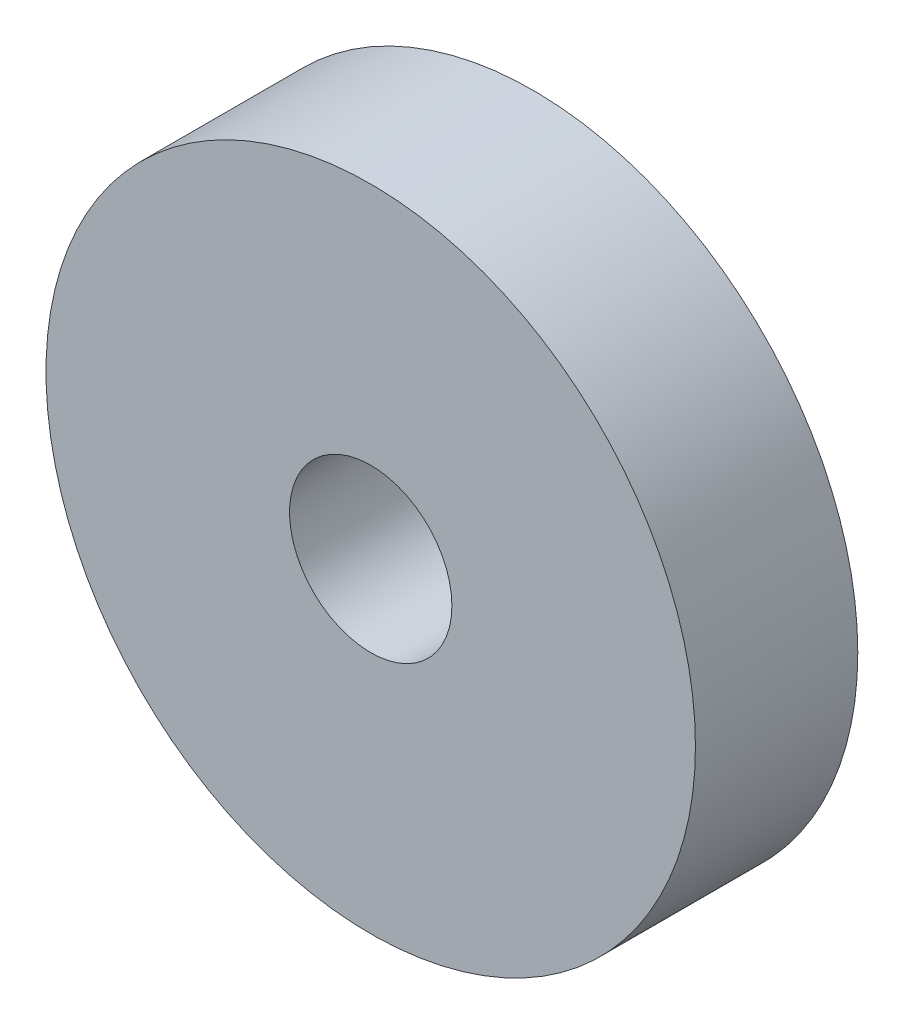
ISO-10303-21;
HEADER;
FILE_DESCRIPTION(('STEP AP214'),'2;1');
FILE_NAME('part.step','',(''),(''),'','','');
FILE_SCHEMA(('AUTOMOTIVE_DESIGN { 1 0 10303 214 1 1 1 1 }'));
ENDSEC;
DATA;
#1=APPLICATION_CONTEXT('core data for automotive mechanical design processes');
#2=APPLICATION_PROTOCOL_DEFINITION('international standard','automotive_design',2000,#1);
#3=PRODUCT_CONTEXT('',#1,'mechanical');
#4=PRODUCT('Part','Part','',(#3));
#5=PRODUCT_RELATED_PRODUCT_CATEGORY('part','',(#4));
#6=PRODUCT_DEFINITION_FORMATION('','',#4);
#7=PRODUCT_DEFINITION_CONTEXT('part definition',#1,'design');
#8=PRODUCT_DEFINITION('design','',#6,#7);
#9=PRODUCT_DEFINITION_SHAPE('','',#8);
#10=(LENGTH_UNIT() NAMED_UNIT(*) SI_UNIT(.MILLI.,.METRE.));
#11=(NAMED_UNIT(*) PLANE_ANGLE_UNIT() SI_UNIT($,.RADIAN.));
#12=(NAMED_UNIT(*) SI_UNIT($,.STERADIAN.) SOLID_ANGLE_UNIT());
#13=UNCERTAINTY_MEASURE_WITH_UNIT(LENGTH_MEASURE(1.E-05),#10,'distance_accuracy_value','');
#14=(GEOMETRIC_REPRESENTATION_CONTEXT(3) GLOBAL_UNCERTAINTY_ASSIGNED_CONTEXT((#13)) GLOBAL_UNIT_ASSIGNED_CONTEXT((#10,
#11,#12)) REPRESENTATION_CONTEXT('',''));
#15=CARTESIAN_POINT('',(0.,0.,0.));
#16=DIRECTION('',(0.,0.,1.));
#17=DIRECTION('',(1.,0.,0.));
#18=AXIS2_PLACEMENT_3D('',#15,#16,#17);
#19=CARTESIAN_POINT('',(0.,0.,12.7));
#20=DIRECTION('',(0.,0.,1.));
#21=DIRECTION('',(1.,0.,0.));
#22=AXIS2_PLACEMENT_3D('',#19,#20,#21);
#23=PLANE('',#22);
#24=CARTESIAN_POINT('',(0.,0.,12.7));
#25=DIRECTION('',(0.,0.,1.));
#26=DIRECTION('',(1.,0.,0.));
#27=AXIS2_PLACEMENT_3D('',#24,#25,#26);
#28=CIRCLE('',#27,25.4);
#29=CARTESIAN_POINT('',(25.4,0.,12.7));
#30=VERTEX_POINT('',#29);
#31=EDGE_CURVE('E10',#30,#30,#28,.T.);
#32=ORIENTED_EDGE('',*,*,#31,.T.);
#33=EDGE_LOOP('',(#32));
#34=FACE_BOUND('',#33,.T.);
#35=CARTESIAN_POINT('',(0.,0.,12.7));
#36=DIRECTION('',(0.,0.,1.));
#37=DIRECTION('',(1.,0.,0.));
#38=AXIS2_PLACEMENT_3D('',#35,#36,#37);
#39=CIRCLE('',#38,6.35);
#40=CARTESIAN_POINT('',(6.35,0.,12.7));
#41=VERTEX_POINT('',#40);
#42=EDGE_CURVE('E46',#41,#41,#39,.T.);
#43=ORIENTED_EDGE('',*,*,#42,.F.);
#44=EDGE_LOOP('',(#43));
#45=FACE_BOUND('',#44,.T.);
#46=ADVANCED_FACE('F35',(#34,#45),#23,.T.);
#47=CARTESIAN_POINT('',(0.,0.,0.));
#48=DIRECTION('',(0.,0.,1.));
#49=DIRECTION('',(1.,0.,0.));
#50=AXIS2_PLACEMENT_3D('',#47,#48,#49);
#51=PLANE('',#50);
#52=CARTESIAN_POINT('',(0.,0.,0.));
#53=DIRECTION('',(0.,0.,1.));
#54=DIRECTION('',(1.,0.,0.));
#55=AXIS2_PLACEMENT_3D('',#52,#53,#54);
#56=CIRCLE('',#55,25.4);
#57=CARTESIAN_POINT('',(25.4,0.,0.));
#58=VERTEX_POINT('',#57);
#59=EDGE_CURVE('E39',#58,#58,#56,.T.);
#60=ORIENTED_EDGE('',*,*,#59,.F.);
#61=EDGE_LOOP('',(#60));
#62=FACE_BOUND('',#61,.T.);
#63=CARTESIAN_POINT('',(0.,0.,0.));
#64=DIRECTION('',(0.,0.,1.));
#65=DIRECTION('',(1.,0.,0.));
#66=AXIS2_PLACEMENT_3D('',#63,#64,#65);
#67=CIRCLE('',#66,6.35);
#68=CARTESIAN_POINT('',(6.35,0.,0.));
#69=VERTEX_POINT('',#68);
#70=EDGE_CURVE('E48',#69,#69,#67,.T.);
#71=ORIENTED_EDGE('',*,*,#70,.T.);
#72=EDGE_LOOP('',(#71));
#73=FACE_BOUND('',#72,.T.);
#74=ADVANCED_FACE('F58',(#62,#73),#51,.F.);
#75=CARTESIAN_POINT('',(0.,0.,12.7));
#76=DIRECTION('',(0.,0.,-1.));
#77=DIRECTION('',(-1.,0.,0.));
#78=AXIS2_PLACEMENT_3D('',#75,#76,#77);
#79=CYLINDRICAL_SURFACE('',#78,25.4);
#80=ORIENTED_EDGE('',*,*,#31,.F.);
#81=EDGE_LOOP('',(#80));
#82=FACE_BOUND('',#81,.T.);
#83=ORIENTED_EDGE('',*,*,#59,.T.);
#84=EDGE_LOOP('',(#83));
#85=FACE_BOUND('',#84,.T.);
#86=ADVANCED_FACE('F37',(#82,#85),#79,.T.);
#87=CARTESIAN_POINT('',(0.,0.,12.7));
#88=DIRECTION('',(0.,0.,-1.));
#89=DIRECTION('',(-1.,0.,0.));
#90=AXIS2_PLACEMENT_3D('',#87,#88,#89);
#91=CYLINDRICAL_SURFACE('',#90,6.35);
#92=ORIENTED_EDGE('',*,*,#42,.T.);
#93=EDGE_LOOP('',(#92));
#94=FACE_BOUND('',#93,.T.);
#95=ORIENTED_EDGE('',*,*,#70,.F.);
#96=EDGE_LOOP('',(#95));
#97=FACE_BOUND('',#96,.T.);
#98=ADVANCED_FACE('F54',(#94,#97),#91,.F.);
#99=CLOSED_SHELL('',(#46,#74,#86,#98));
#100=MANIFOLD_SOLID_BREP('B2',#99);
#101=ADVANCED_BREP_SHAPE_REPRESENTATION('',(#18,#100),#14);
#102=SHAPE_DEFINITION_REPRESENTATION(#9,#101);
ENDSEC;
END-ISO-10303-21;
